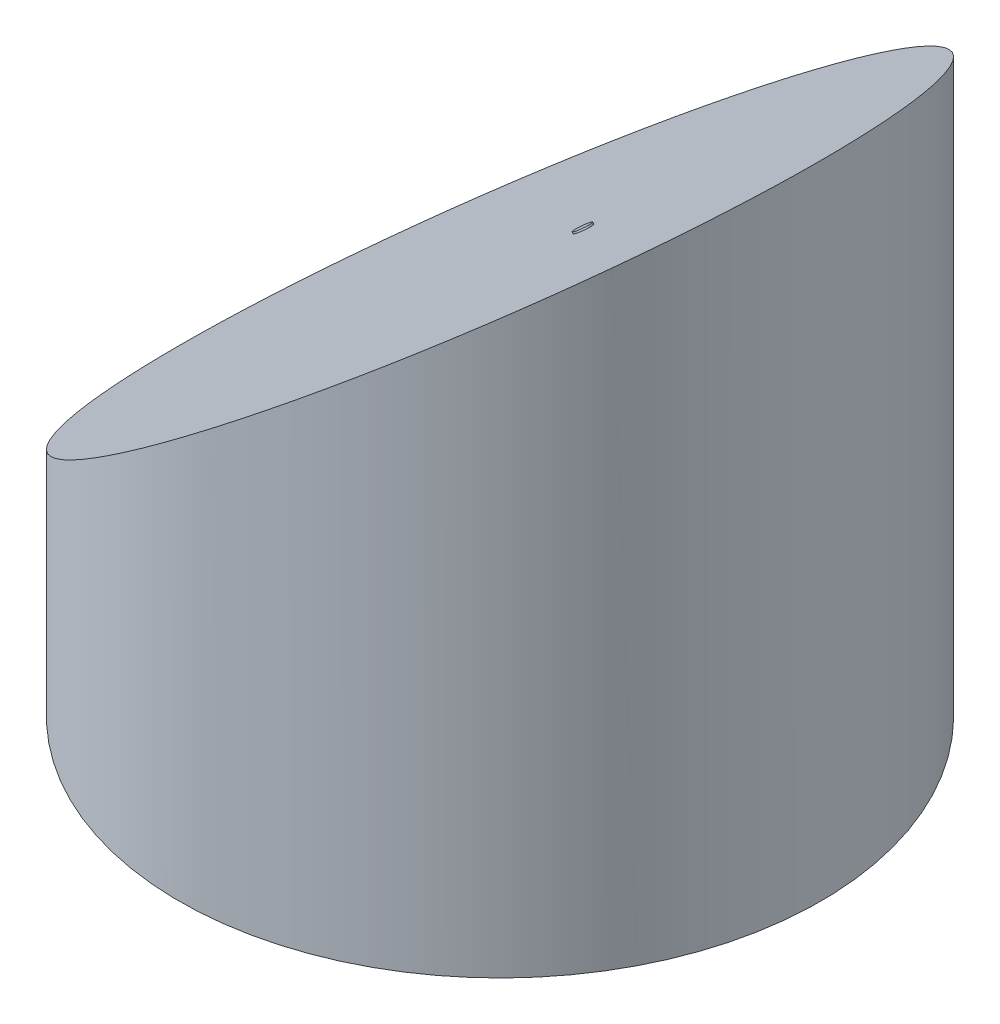
ISO-10303-21;
HEADER;
FILE_DESCRIPTION(('STEP AP214'),'2;1');
FILE_NAME('part.step','',(''),(''),'','','');
FILE_SCHEMA(('AUTOMOTIVE_DESIGN { 1 0 10303 214 1 1 1 1 }'));
ENDSEC;
DATA;
#1=APPLICATION_CONTEXT('core data for automotive mechanical design processes');
#2=APPLICATION_PROTOCOL_DEFINITION('international standard','automotive_design',2000,#1);
#3=PRODUCT_CONTEXT('',#1,'mechanical');
#4=PRODUCT('Part','Part','',(#3));
#5=PRODUCT_RELATED_PRODUCT_CATEGORY('part','',(#4));
#6=PRODUCT_DEFINITION_FORMATION('','',#4);
#7=PRODUCT_DEFINITION_CONTEXT('part definition',#1,'design');
#8=PRODUCT_DEFINITION('design','',#6,#7);
#9=PRODUCT_DEFINITION_SHAPE('','',#8);
#10=(LENGTH_UNIT() NAMED_UNIT(*) SI_UNIT(.MILLI.,.METRE.));
#11=(NAMED_UNIT(*) PLANE_ANGLE_UNIT() SI_UNIT($,.RADIAN.));
#12=(NAMED_UNIT(*) SI_UNIT($,.STERADIAN.) SOLID_ANGLE_UNIT());
#13=UNCERTAINTY_MEASURE_WITH_UNIT(LENGTH_MEASURE(1.E-05),#10,'distance_accuracy_value','');
#14=(GEOMETRIC_REPRESENTATION_CONTEXT(3) GLOBAL_UNCERTAINTY_ASSIGNED_CONTEXT((#13)) GLOBAL_UNIT_ASSIGNED_CONTEXT((#10,
#11,#12)) REPRESENTATION_CONTEXT('',''));
#15=CARTESIAN_POINT('',(0.,0.,0.));
#16=DIRECTION('',(0.,0.,1.));
#17=DIRECTION('',(1.,0.,0.));
#18=AXIS2_PLACEMENT_3D('',#15,#16,#17);
#19=CARTESIAN_POINT('',(4.44089209850063E-13,3000.,0.));
#20=DIRECTION('',(0.,1.,0.));
#21=DIRECTION('',(-1.,0.,0.));
#22=AXIS2_PLACEMENT_3D('',#19,#20,#21);
#23=CYLINDRICAL_SURFACE('',#22,2000.);
#24=CARTESIAN_POINT('',(4.6124659985742E-13,1500.53976291181,0.));
#25=DIRECTION('',(0.599861793841736,-0.80010363596785,0.));
#26=DIRECTION('',(0.80010363596785,0.599861793841736,0.));
#27=AXIS2_PLACEMENT_3D('',#24,#25,#26);
#28=ELLIPSE('',#27,2499.67617954978,2000.);
#29=CARTESIAN_POINT('',(2000.,3000.,0.));
#30=VERTEX_POINT('',#29);
#31=EDGE_CURVE('E38',#30,#30,#28,.F.);
#32=ORIENTED_EDGE('',*,*,#31,.F.);
#33=EDGE_LOOP('',(#32));
#34=FACE_BOUND('',#33,.T.);
#35=CARTESIAN_POINT('',(4.89858719658941E-13,-1000.,0.));
#36=DIRECTION('',(0.,1.,0.));
#37=DIRECTION('',(-1.,0.,0.));
#38=AXIS2_PLACEMENT_3D('',#35,#36,#37);
#39=CIRCLE('',#38,2000.);
#40=CARTESIAN_POINT('',(-2000.,-1000.,0.));
#41=VERTEX_POINT('',#40);
#42=EDGE_CURVE('E42',#41,#41,#39,.T.);
#43=ORIENTED_EDGE('',*,*,#42,.T.);
#44=EDGE_LOOP('',(#43));
#45=FACE_BOUND('',#44,.T.);
#46=ADVANCED_FACE('F31',(#34,#45),#23,.T.);
#47=CARTESIAN_POINT('',(4.89858719658941E-13,-1000.,0.));
#48=DIRECTION('',(0.,-1.,0.));
#49=DIRECTION('',(1.,0.,0.));
#50=AXIS2_PLACEMENT_3D('',#47,#48,#49);
#51=PLANE('',#50);
#52=ORIENTED_EDGE('',*,*,#42,.F.);
#53=EDGE_LOOP('',(#52));
#54=FACE_BOUND('',#53,.T.);
#55=ADVANCED_FACE('F33',(#54),#51,.T.);
#56=CARTESIAN_POINT('',(-2000.,1.07952582362691,-2000.));
#57=DIRECTION('',(0.599861793841736,-0.80010363596785,0.));
#58=DIRECTION('',(0.80010363596785,0.599861793841736,0.));
#59=AXIS2_PLACEMENT_3D('',#56,#57,#58);
#60=PLANE('',#59);
#61=CARTESIAN_POINT('',(520.326453298728,1890.6441764251,0.));
#62=DIRECTION('',(0.599861793841736,-0.80010363596785,0.));
#63=DIRECTION('',(0.80010363596785,0.599861793841736,0.));
#64=AXIS2_PLACEMENT_3D('',#61,#62,#63);
#65=CIRCLE('',#64,50.0000000000001);
#66=CARTESIAN_POINT('',(560.331635097121,1920.63726611718,0.));
#67=VERTEX_POINT('',#66);
#68=EDGE_CURVE('E10',#67,#67,#65,.F.);
#69=ORIENTED_EDGE('',*,*,#68,.F.);
#70=EDGE_LOOP('',(#69));
#71=FACE_BOUND('',#70,.T.);
#72=ORIENTED_EDGE('',*,*,#31,.T.);
#73=EDGE_LOOP('',(#72));
#74=FACE_BOUND('',#73,.T.);
#75=ADVANCED_FACE('F56',(#71,#74),#60,.F.);
#76=CARTESIAN_POINT('',(514.32783536031,1898.64521278477,0.));
#77=DIRECTION('',(0.599861793841736,-0.80010363596785,0.));
#78=DIRECTION('',(0.80010363596785,0.599861793841736,0.));
#79=AXIS2_PLACEMENT_3D('',#76,#77,#78);
#80=CYLINDRICAL_SURFACE('',#79,50.0000000000001);
#81=CARTESIAN_POINT('',(514.32783536031,1898.64521278477,0.));
#82=DIRECTION('',(-0.599861793841736,0.80010363596785,0.));
#83=DIRECTION('',(-0.80010363596785,-0.599861793841736,0.));
#84=AXIS2_PLACEMENT_3D('',#81,#82,#83);
#85=CIRCLE('',#84,50.0000000000001);
#86=CARTESIAN_POINT('',(474.322653561918,1868.65212309269,0.));
#87=VERTEX_POINT('',#86);
#88=EDGE_CURVE('E46',#87,#87,#85,.T.);
#89=ORIENTED_EDGE('',*,*,#88,.F.);
#90=EDGE_LOOP('',(#89));
#91=FACE_BOUND('',#90,.T.);
#92=ORIENTED_EDGE('',*,*,#68,.T.);
#93=EDGE_LOOP('',(#92));
#94=FACE_BOUND('',#93,.T.);
#95=ADVANCED_FACE('F54',(#91,#94),#80,.T.);
#96=CARTESIAN_POINT('',(514.32783536031,1898.64521278477,0.));
#97=DIRECTION('',(-0.599861793841736,0.80010363596785,0.));
#98=DIRECTION('',(-0.80010363596785,-0.599861793841736,0.));
#99=AXIS2_PLACEMENT_3D('',#96,#97,#98);
#100=PLANE('',#99);
#101=ORIENTED_EDGE('',*,*,#88,.T.);
#102=EDGE_LOOP('',(#101));
#103=FACE_BOUND('',#102,.T.);
#104=ADVANCED_FACE('F52',(#103),#100,.T.);
#105=CLOSED_SHELL('',(#46,#55,#75,#95,#104));
#106=MANIFOLD_SOLID_BREP('B2',#105);
#107=ADVANCED_BREP_SHAPE_REPRESENTATION('',(#18,#106),#14);
#108=SHAPE_DEFINITION_REPRESENTATION(#9,#107);
ENDSEC;
END-ISO-10303-21;
